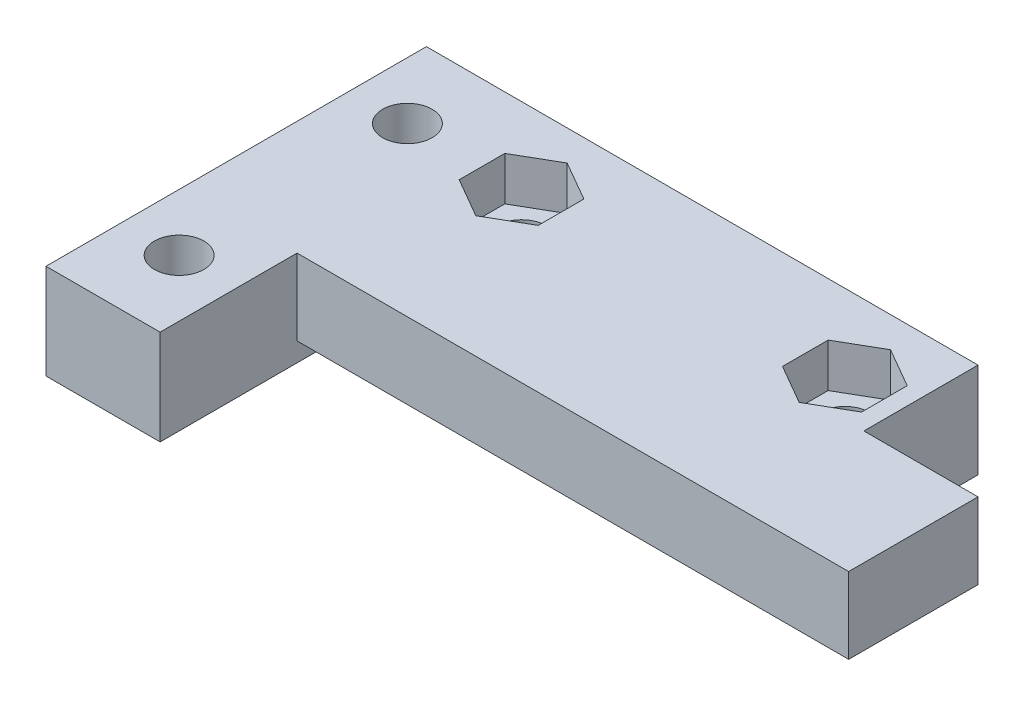
ISO-10303-21;
HEADER;
FILE_DESCRIPTION(('STEP AP214'),'2;1');
FILE_NAME('part.step','',(''),(''),'','','');
FILE_SCHEMA(('AUTOMOTIVE_DESIGN { 1 0 10303 214 1 1 1 1 }'));
ENDSEC;
DATA;
#1=APPLICATION_CONTEXT('core data for automotive mechanical design processes');
#2=APPLICATION_PROTOCOL_DEFINITION('international standard','automotive_design',2000,#1);
#3=PRODUCT_CONTEXT('',#1,'mechanical');
#4=PRODUCT('Part','Part','',(#3));
#5=PRODUCT_RELATED_PRODUCT_CATEGORY('part','',(#4));
#6=PRODUCT_DEFINITION_FORMATION('','',#4);
#7=PRODUCT_DEFINITION_CONTEXT('part definition',#1,'design');
#8=PRODUCT_DEFINITION('design','',#6,#7);
#9=PRODUCT_DEFINITION_SHAPE('','',#8);
#10=(LENGTH_UNIT() NAMED_UNIT(*) SI_UNIT(.MILLI.,.METRE.));
#11=(NAMED_UNIT(*) PLANE_ANGLE_UNIT() SI_UNIT($,.RADIAN.));
#12=(NAMED_UNIT(*) SI_UNIT($,.STERADIAN.) SOLID_ANGLE_UNIT());
#13=UNCERTAINTY_MEASURE_WITH_UNIT(LENGTH_MEASURE(1.E-05),#10,'distance_accuracy_value','');
#14=(GEOMETRIC_REPRESENTATION_CONTEXT(3) GLOBAL_UNCERTAINTY_ASSIGNED_CONTEXT((#13)) GLOBAL_UNIT_ASSIGNED_CONTEXT((#10,
#11,#12)) REPRESENTATION_CONTEXT('',''));
#15=CARTESIAN_POINT('',(0.,0.,0.));
#16=DIRECTION('',(0.,0.,1.));
#17=DIRECTION('',(1.,0.,0.));
#18=AXIS2_PLACEMENT_3D('',#15,#16,#17);
#19=CARTESIAN_POINT('',(3.,5.,-16.));
#20=DIRECTION('',(0.,-1.,0.));
#21=DIRECTION('',(0.,0.,-1.));
#22=AXIS2_PLACEMENT_3D('',#19,#20,#21);
#23=CYLINDRICAL_SURFACE('',#22,1.3);
#24=CARTESIAN_POINT('',(3.,5.,-16.));
#25=DIRECTION('',(0.,1.,0.));
#26=DIRECTION('',(0.,0.,1.));
#27=AXIS2_PLACEMENT_3D('',#24,#25,#26);
#28=CIRCLE('',#27,1.3);
#29=CARTESIAN_POINT('',(3.,5.,-14.7));
#30=VERTEX_POINT('',#29);
#31=EDGE_CURVE('E296',#30,#30,#28,.T.);
#32=ORIENTED_EDGE('',*,*,#31,.T.);
#33=EDGE_LOOP('',(#32));
#34=FACE_BOUND('',#33,.T.);
#35=CARTESIAN_POINT('',(3.,2.,-16.));
#36=DIRECTION('',(0.,-1.,0.));
#37=DIRECTION('',(0.,0.,-1.));
#38=AXIS2_PLACEMENT_3D('',#35,#36,#37);
#39=CIRCLE('',#38,1.3);
#40=CARTESIAN_POINT('',(3.,2.,-17.3));
#41=VERTEX_POINT('',#40);
#42=EDGE_CURVE('E37',#41,#41,#39,.T.);
#43=ORIENTED_EDGE('',*,*,#42,.T.);
#44=EDGE_LOOP('',(#43));
#45=FACE_BOUND('',#44,.T.);
#46=ADVANCED_FACE('F33',(#34,#45),#23,.F.);
#47=CARTESIAN_POINT('',(3.,5.,-4.));
#48=DIRECTION('',(0.,-1.,0.));
#49=DIRECTION('',(0.,0.,-1.));
#50=AXIS2_PLACEMENT_3D('',#47,#48,#49);
#51=CYLINDRICAL_SURFACE('',#50,1.3);
#52=CARTESIAN_POINT('',(3.,5.,-4.));
#53=DIRECTION('',(0.,1.,0.));
#54=DIRECTION('',(0.,0.,1.));
#55=AXIS2_PLACEMENT_3D('',#52,#53,#54);
#56=CIRCLE('',#55,1.3);
#57=CARTESIAN_POINT('',(3.,5.,-2.7));
#58=VERTEX_POINT('',#57);
#59=EDGE_CURVE('E293',#58,#58,#56,.T.);
#60=ORIENTED_EDGE('',*,*,#59,.T.);
#61=EDGE_LOOP('',(#60));
#62=FACE_BOUND('',#61,.T.);
#63=CARTESIAN_POINT('',(3.,2.,-4.));
#64=DIRECTION('',(0.,-1.,0.));
#65=DIRECTION('',(0.,0.,-1.));
#66=AXIS2_PLACEMENT_3D('',#63,#64,#65);
#67=CIRCLE('',#66,1.3);
#68=CARTESIAN_POINT('',(3.,2.,-5.3));
#69=VERTEX_POINT('',#68);
#70=EDGE_CURVE('E220',#69,#69,#67,.T.);
#71=ORIENTED_EDGE('',*,*,#70,.T.);
#72=EDGE_LOOP('',(#71));
#73=FACE_BOUND('',#72,.T.);
#74=ADVANCED_FACE('F404',(#62,#73),#51,.F.);
#75=CARTESIAN_POINT('',(26.,5.,-16.));
#76=DIRECTION('',(0.,-1.,0.));
#77=DIRECTION('',(0.,0.,-1.));
#78=AXIS2_PLACEMENT_3D('',#75,#76,#77);
#79=CYLINDRICAL_SURFACE('',#78,1.3);
#80=CARTESIAN_POINT('',(26.,0.,-16.));
#81=DIRECTION('',(0.,1.,0.));
#82=DIRECTION('',(0.,0.,1.));
#83=AXIS2_PLACEMENT_3D('',#80,#81,#82);
#84=CIRCLE('',#83,1.3);
#85=CARTESIAN_POINT('',(26.,0.,-14.7));
#86=VERTEX_POINT('',#85);
#87=EDGE_CURVE('E287',#86,#86,#84,.T.);
#88=ORIENTED_EDGE('',*,*,#87,.F.);
#89=EDGE_LOOP('',(#88));
#90=FACE_BOUND('',#89,.T.);
#91=CARTESIAN_POINT('',(26.,2.7,-16.));
#92=DIRECTION('',(0.,1.,0.));
#93=DIRECTION('',(0.,0.,1.));
#94=AXIS2_PLACEMENT_3D('',#91,#92,#93);
#95=CIRCLE('',#94,1.3);
#96=CARTESIAN_POINT('',(26.,2.7,-14.7));
#97=VERTEX_POINT('',#96);
#98=EDGE_CURVE('E232',#97,#97,#95,.T.);
#99=ORIENTED_EDGE('',*,*,#98,.T.);
#100=EDGE_LOOP('',(#99));
#101=FACE_BOUND('',#100,.T.);
#102=ADVANCED_FACE('F410',(#90,#101),#79,.F.);
#103=CARTESIAN_POINT('',(9.,5.,-16.));
#104=DIRECTION('',(0.,-1.,0.));
#105=DIRECTION('',(0.,0.,-1.));
#106=AXIS2_PLACEMENT_3D('',#103,#104,#105);
#107=CYLINDRICAL_SURFACE('',#106,1.3);
#108=CARTESIAN_POINT('',(9.,0.,-16.));
#109=DIRECTION('',(0.,1.,0.));
#110=DIRECTION('',(0.,0.,1.));
#111=AXIS2_PLACEMENT_3D('',#108,#109,#110);
#112=CIRCLE('',#111,1.3);
#113=CARTESIAN_POINT('',(9.,0.,-14.7));
#114=VERTEX_POINT('',#113);
#115=EDGE_CURVE('E290',#114,#114,#112,.T.);
#116=ORIENTED_EDGE('',*,*,#115,.F.);
#117=EDGE_LOOP('',(#116));
#118=FACE_BOUND('',#117,.T.);
#119=CARTESIAN_POINT('',(9.,2.7,-16.));
#120=DIRECTION('',(0.,1.,0.));
#121=DIRECTION('',(0.,0.,1.));
#122=AXIS2_PLACEMENT_3D('',#119,#120,#121);
#123=CIRCLE('',#122,1.3);
#124=CARTESIAN_POINT('',(9.,2.7,-14.7));
#125=VERTEX_POINT('',#124);
#126=EDGE_CURVE('E277',#125,#125,#123,.T.);
#127=ORIENTED_EDGE('',*,*,#126,.T.);
#128=EDGE_LOOP('',(#127));
#129=FACE_BOUND('',#128,.T.);
#130=ADVANCED_FACE('F446',(#118,#129),#107,.F.);
#131=CARTESIAN_POINT('',(0.,5.,0.));
#132=DIRECTION('',(0.,-1.,0.));
#133=DIRECTION('',(0.,0.,-1.));
#134=AXIS2_PLACEMENT_3D('',#131,#132,#133);
#135=PLANE('',#134);
#136=DIRECTION('',(-0.866025403784439,0.,0.5));
#137=VECTOR('',#136,1.);
#138=CARTESIAN_POINT('',(-1.46743371481683,5.,-2.5416697508023));
#139=LINE('',#138,#137);
#140=CARTESIAN_POINT('',(26.,5.,-18.4));
#141=VERTEX_POINT('',#140);
#142=CARTESIAN_POINT('',(23.9215390309173,5.,-17.2));
#143=VERTEX_POINT('',#142);
#144=EDGE_CURVE('E219',#141,#143,#139,.T.);
#145=ORIENTED_EDGE('',*,*,#144,.F.);
#146=DIRECTION('',(-0.866025403784439,0.,-0.499999999999999));
#147=VECTOR('',#146,1.);
#148=CARTESIAN_POINT('',(14.4674337148168,5.,-25.0583302491977));
#149=LINE('',#148,#147);
#150=CARTESIAN_POINT('',(28.0784609690827,5.,-17.2));
#151=VERTEX_POINT('',#150);
#152=EDGE_CURVE('E50',#151,#141,#149,.T.);
#153=ORIENTED_EDGE('',*,*,#152,.F.);
#154=DIRECTION('',(0.,0.,-1.));
#155=VECTOR('',#154,1.);
#156=CARTESIAN_POINT('',(28.0784609690827,5.,0.));
#157=LINE('',#156,#155);
#158=CARTESIAN_POINT('',(28.0784609690827,5.,-14.8));
#159=VERTEX_POINT('',#158);
#160=EDGE_CURVE('E202',#159,#151,#157,.T.);
#161=ORIENTED_EDGE('',*,*,#160,.F.);
#162=DIRECTION('',(0.866025403784439,0.,-0.5));
#163=VECTOR('',#162,1.);
#164=CARTESIAN_POINT('',(0.611027254265821,5.,1.05833024919771));
#165=LINE('',#164,#163);
#166=CARTESIAN_POINT('',(26.,5.,-13.6));
#167=VERTEX_POINT('',#166);
#168=EDGE_CURVE('E205',#167,#159,#165,.T.);
#169=ORIENTED_EDGE('',*,*,#168,.F.);
#170=DIRECTION('',(0.866025403784439,0.,0.5));
#171=VECTOR('',#170,1.);
#172=CARTESIAN_POINT('',(12.3889727457342,5.,-21.4583302491977));
#173=LINE('',#172,#171);
#174=CARTESIAN_POINT('',(23.9215390309174,5.,-14.8));
#175=VERTEX_POINT('',#174);
#176=EDGE_CURVE('E225',#175,#167,#173,.T.);
#177=ORIENTED_EDGE('',*,*,#176,.F.);
#178=DIRECTION('',(0.,0.,1.));
#179=VECTOR('',#178,1.);
#180=CARTESIAN_POINT('',(23.9215390309173,5.,0.));
#181=LINE('',#180,#179);
#182=EDGE_CURVE('E222',#143,#175,#181,.T.);
#183=ORIENTED_EDGE('',*,*,#182,.F.);
#184=EDGE_LOOP('',(#145,#153,#161,#169,#177,#183));
#185=FACE_BOUND('',#184,.T.);
#186=DIRECTION('',(-0.866025403784439,0.,0.5));
#187=VECTOR('',#186,1.);
#188=CARTESIAN_POINT('',(-5.71743371481683,5.,-9.90288568297003));
#189=LINE('',#188,#187);
#190=CARTESIAN_POINT('',(9.00000000000001,5.,-18.4));
#191=VERTEX_POINT('',#190);
#192=CARTESIAN_POINT('',(6.92153903091735,5.,-17.2));
#193=VERTEX_POINT('',#192);
#194=EDGE_CURVE('E261',#191,#193,#189,.T.);
#195=ORIENTED_EDGE('',*,*,#194,.F.);
#196=DIRECTION('',(-0.866025403784438,0.,-0.500000000000002));
#197=VECTOR('',#196,1.);
#198=CARTESIAN_POINT('',(10.2174337148169,5.,-17.69711431703));
#199=LINE('',#198,#197);
#200=CARTESIAN_POINT('',(11.0784609690827,5.,-17.2));
#201=VERTEX_POINT('',#200);
#202=EDGE_CURVE('E58',#201,#191,#199,.T.);
#203=ORIENTED_EDGE('',*,*,#202,.F.);
#204=DIRECTION('',(0.,0.,-1.));
#205=VECTOR('',#204,1.);
#206=CARTESIAN_POINT('',(11.0784609690827,5.,0.));
#207=LINE('',#206,#205);
#208=CARTESIAN_POINT('',(11.0784609690827,5.,-14.8));
#209=VERTEX_POINT('',#208);
#210=EDGE_CURVE('E244',#209,#201,#207,.T.);
#211=ORIENTED_EDGE('',*,*,#210,.F.);
#212=DIRECTION('',(0.866025403784439,0.,-0.5));
#213=VECTOR('',#212,1.);
#214=CARTESIAN_POINT('',(-3.63897274573418,5.,-6.30288568297002));
#215=LINE('',#214,#213);
#216=CARTESIAN_POINT('',(9.,5.,-13.6));
#217=VERTEX_POINT('',#216);
#218=EDGE_CURVE('E270',#217,#209,#215,.T.);
#219=ORIENTED_EDGE('',*,*,#218,.F.);
#220=DIRECTION('',(0.866025403784438,0.,0.5));
#221=VECTOR('',#220,1.);
#222=CARTESIAN_POINT('',(8.13897274573419,5.,-14.09711431703));
#223=LINE('',#222,#221);
#224=CARTESIAN_POINT('',(6.92153903091735,5.,-14.8));
#225=VERTEX_POINT('',#224);
#226=EDGE_CURVE('E267',#225,#217,#223,.T.);
#227=ORIENTED_EDGE('',*,*,#226,.F.);
#228=DIRECTION('',(0.,0.,1.));
#229=VECTOR('',#228,1.);
#230=CARTESIAN_POINT('',(6.92153903091735,5.,0.));
#231=LINE('',#230,#229);
#232=EDGE_CURVE('E264',#193,#225,#231,.T.);
#233=ORIENTED_EDGE('',*,*,#232,.F.);
#234=EDGE_LOOP('',(#195,#203,#211,#219,#227,#233));
#235=FACE_BOUND('',#234,.T.);
#236=ORIENTED_EDGE('',*,*,#31,.F.);
#237=EDGE_LOOP('',(#236));
#238=FACE_BOUND('',#237,.T.);
#239=DIRECTION('',(0.,0.,1.));
#240=VECTOR('',#239,1.);
#241=CARTESIAN_POINT('',(29.,5.,-20.));
#242=LINE('',#241,#240);
#243=CARTESIAN_POINT('',(29.,5.,-20.));
#244=VERTEX_POINT('',#243);
#245=CARTESIAN_POINT('',(29.,5.,-14.));
#246=VERTEX_POINT('',#245);
#247=EDGE_CURVE('E300',#244,#246,#242,.T.);
#248=ORIENTED_EDGE('',*,*,#247,.F.);
#249=DIRECTION('',(-1.,0.,0.));
#250=VECTOR('',#249,1.);
#251=CARTESIAN_POINT('',(0.,5.,-20.));
#252=LINE('',#251,#250);
#253=CARTESIAN_POINT('',(0.,5.,-20.));
#254=VERTEX_POINT('',#253);
#255=EDGE_CURVE('E354',#244,#254,#252,.T.);
#256=ORIENTED_EDGE('',*,*,#255,.T.);
#257=DIRECTION('',(0.,0.,1.));
#258=VECTOR('',#257,1.);
#259=CARTESIAN_POINT('',(0.,5.,0.));
#260=LINE('',#259,#258);
#261=CARTESIAN_POINT('',(0.,5.,0.));
#262=VERTEX_POINT('',#261);
#263=EDGE_CURVE('E344',#254,#262,#260,.T.);
#264=ORIENTED_EDGE('',*,*,#263,.T.);
#265=DIRECTION('',(1.,0.,0.));
#266=VECTOR('',#265,1.);
#267=CARTESIAN_POINT('',(0.,5.,0.));
#268=LINE('',#267,#266);
#269=CARTESIAN_POINT('',(6.,5.,0.));
#270=VERTEX_POINT('',#269);
#271=EDGE_CURVE('E347',#262,#270,#268,.T.);
#272=ORIENTED_EDGE('',*,*,#271,.T.);
#273=DIRECTION('',(0.,0.,1.));
#274=VECTOR('',#273,1.);
#275=CARTESIAN_POINT('',(6.,5.,0.));
#276=LINE('',#275,#274);
#277=CARTESIAN_POINT('',(6.,5.,-7.2));
#278=VERTEX_POINT('',#277);
#279=EDGE_CURVE('E313',#278,#270,#276,.T.);
#280=ORIENTED_EDGE('',*,*,#279,.F.);
#281=DIRECTION('',(-1.,0.,0.));
#282=VECTOR('',#281,1.);
#283=CARTESIAN_POINT('',(6.,5.,-7.2));
#284=LINE('',#283,#282);
#285=CARTESIAN_POINT('',(35.,5.,-7.2));
#286=VERTEX_POINT('',#285);
#287=EDGE_CURVE('E316',#286,#278,#284,.T.);
#288=ORIENTED_EDGE('',*,*,#287,.F.);
#289=DIRECTION('',(0.,0.,-1.));
#290=VECTOR('',#289,1.);
#291=CARTESIAN_POINT('',(35.,5.,0.));
#292=LINE('',#291,#290);
#293=CARTESIAN_POINT('',(35.,5.,-14.));
#294=VERTEX_POINT('',#293);
#295=EDGE_CURVE('E351',#286,#294,#292,.T.);
#296=ORIENTED_EDGE('',*,*,#295,.T.);
#297=DIRECTION('',(1.,0.,0.));
#298=VECTOR('',#297,1.);
#299=CARTESIAN_POINT('',(35.,5.,-14.));
#300=LINE('',#299,#298);
#301=EDGE_CURVE('E302',#246,#294,#300,.T.);
#302=ORIENTED_EDGE('',*,*,#301,.F.);
#303=EDGE_LOOP('',(#248,#256,#264,#272,#280,#288,#296,#302));
#304=FACE_BOUND('',#303,.T.);
#305=ORIENTED_EDGE('',*,*,#59,.F.);
#306=EDGE_LOOP('',(#305));
#307=FACE_BOUND('',#306,.T.);
#308=ADVANCED_FACE('F442',(#185,#235,#238,#304,#307),#135,.F.);
#309=CARTESIAN_POINT('',(0.,0.,0.));
#310=DIRECTION('',(0.,-1.,0.));
#311=DIRECTION('',(0.,0.,-1.));
#312=AXIS2_PLACEMENT_3D('',#309,#310,#311);
#313=PLANE('',#312);
#314=CARTESIAN_POINT('',(3.,0.,-16.));
#315=DIRECTION('',(0.,-1.,0.));
#316=DIRECTION('',(0.,0.,-1.));
#317=AXIS2_PLACEMENT_3D('',#314,#315,#316);
#318=CIRCLE('',#317,2.2);
#319=CARTESIAN_POINT('',(3.,0.,-18.2));
#320=VERTEX_POINT('',#319);
#321=EDGE_CURVE('E382',#320,#320,#318,.T.);
#322=ORIENTED_EDGE('',*,*,#321,.F.);
#323=EDGE_LOOP('',(#322));
#324=FACE_BOUND('',#323,.T.);
#325=CARTESIAN_POINT('',(3.,0.,-4.));
#326=DIRECTION('',(0.,-1.,0.));
#327=DIRECTION('',(0.,0.,-1.));
#328=AXIS2_PLACEMENT_3D('',#325,#326,#327);
#329=CIRCLE('',#328,2.2);
#330=CARTESIAN_POINT('',(3.,0.,-6.2));
#331=VERTEX_POINT('',#330);
#332=EDGE_CURVE('E208',#331,#331,#329,.T.);
#333=ORIENTED_EDGE('',*,*,#332,.F.);
#334=EDGE_LOOP('',(#333));
#335=FACE_BOUND('',#334,.T.);
#336=ORIENTED_EDGE('',*,*,#115,.T.);
#337=EDGE_LOOP('',(#336));
#338=FACE_BOUND('',#337,.T.);
#339=DIRECTION('',(-1.,0.,0.));
#340=VECTOR('',#339,1.);
#341=CARTESIAN_POINT('',(0.,0.,-20.));
#342=LINE('',#341,#340);
#343=CARTESIAN_POINT('',(29.,0.,-20.));
#344=VERTEX_POINT('',#343);
#345=CARTESIAN_POINT('',(0.,0.,-20.));
#346=VERTEX_POINT('',#345);
#347=EDGE_CURVE('E348',#344,#346,#342,.T.);
#348=ORIENTED_EDGE('',*,*,#347,.F.);
#349=DIRECTION('',(0.,0.,1.));
#350=VECTOR('',#349,1.);
#351=CARTESIAN_POINT('',(29.,0.,-20.));
#352=LINE('',#351,#350);
#353=CARTESIAN_POINT('',(29.,0.,-14.));
#354=VERTEX_POINT('',#353);
#355=EDGE_CURVE('E299',#344,#354,#352,.T.);
#356=ORIENTED_EDGE('',*,*,#355,.T.);
#357=DIRECTION('',(-1.,0.,0.));
#358=VECTOR('',#357,1.);
#359=CARTESIAN_POINT('',(6.,0.,-14.));
#360=LINE('',#359,#358);
#361=CARTESIAN_POINT('',(6.,0.,-14.));
#362=VERTEX_POINT('',#361);
#363=EDGE_CURVE('E328',#354,#362,#360,.T.);
#364=ORIENTED_EDGE('',*,*,#363,.T.);
#365=DIRECTION('',(0.,0.,1.));
#366=VECTOR('',#365,1.);
#367=CARTESIAN_POINT('',(6.,0.,0.));
#368=LINE('',#367,#366);
#369=CARTESIAN_POINT('',(6.,0.,0.));
#370=VERTEX_POINT('',#369);
#371=EDGE_CURVE('E323',#362,#370,#368,.T.);
#372=ORIENTED_EDGE('',*,*,#371,.T.);
#373=DIRECTION('',(1.,0.,0.));
#374=VECTOR('',#373,1.);
#375=CARTESIAN_POINT('',(0.,0.,0.));
#376=LINE('',#375,#374);
#377=CARTESIAN_POINT('',(0.,0.,0.));
#378=VERTEX_POINT('',#377);
#379=EDGE_CURVE('E359',#378,#370,#376,.T.);
#380=ORIENTED_EDGE('',*,*,#379,.F.);
#381=DIRECTION('',(0.,0.,1.));
#382=VECTOR('',#381,1.);
#383=CARTESIAN_POINT('',(0.,0.,0.));
#384=LINE('',#383,#382);
#385=EDGE_CURVE('E343',#346,#378,#384,.T.);
#386=ORIENTED_EDGE('',*,*,#385,.F.);
#387=EDGE_LOOP('',(#348,#356,#364,#372,#380,#386));
#388=FACE_BOUND('',#387,.T.);
#389=ORIENTED_EDGE('',*,*,#87,.T.);
#390=EDGE_LOOP('',(#389));
#391=FACE_BOUND('',#390,.T.);
#392=ADVANCED_FACE('F445',(#324,#335,#338,#388,#391),#313,.T.);
#393=CARTESIAN_POINT('',(35.,5.,0.));
#394=DIRECTION('',(-1.,0.,0.));
#395=DIRECTION('',(0.,0.,1.));
#396=AXIS2_PLACEMENT_3D('',#393,#394,#395);
#397=PLANE('',#396);
#398=DIRECTION('',(0.,-1.,0.));
#399=VECTOR('',#398,1.);
#400=CARTESIAN_POINT('',(35.,5.,-14.));
#401=LINE('',#400,#399);
#402=CARTESIAN_POINT('',(35.,1.,-14.));
#403=VERTEX_POINT('',#402);
#404=EDGE_CURVE('E304',#294,#403,#401,.T.);
#405=ORIENTED_EDGE('',*,*,#404,.F.);
#406=ORIENTED_EDGE('',*,*,#295,.F.);
#407=DIRECTION('',(0.,-1.,0.));
#408=VECTOR('',#407,1.);
#409=CARTESIAN_POINT('',(35.,5.,-7.2));
#410=LINE('',#409,#408);
#411=CARTESIAN_POINT('',(35.,1.,-7.2));
#412=VERTEX_POINT('',#411);
#413=EDGE_CURVE('E320',#286,#412,#410,.T.);
#414=ORIENTED_EDGE('',*,*,#413,.T.);
#415=DIRECTION('',(0.,0.,-1.));
#416=VECTOR('',#415,1.);
#417=CARTESIAN_POINT('',(35.,1.,0.));
#418=LINE('',#417,#416);
#419=EDGE_CURVE('E327',#412,#403,#418,.T.);
#420=ORIENTED_EDGE('',*,*,#419,.T.);
#421=EDGE_LOOP('',(#405,#406,#414,#420));
#422=FACE_BOUND('',#421,.T.);
#423=ADVANCED_FACE('F450',(#422),#397,.F.);
#424=CARTESIAN_POINT('',(0.,5.,-20.));
#425=DIRECTION('',(0.,0.,1.));
#426=DIRECTION('',(1.,0.,0.));
#427=AXIS2_PLACEMENT_3D('',#424,#425,#426);
#428=PLANE('',#427);
#429=DIRECTION('',(0.,-1.,0.));
#430=VECTOR('',#429,1.);
#431=CARTESIAN_POINT('',(29.,5.,-20.));
#432=LINE('',#431,#430);
#433=EDGE_CURVE('E310',#244,#344,#432,.T.);
#434=ORIENTED_EDGE('',*,*,#433,.T.);
#435=ORIENTED_EDGE('',*,*,#347,.T.);
#436=DIRECTION('',(0.,-1.,0.));
#437=VECTOR('',#436,1.);
#438=CARTESIAN_POINT('',(0.,5.,-20.));
#439=LINE('',#438,#437);
#440=EDGE_CURVE('E356',#254,#346,#439,.T.);
#441=ORIENTED_EDGE('',*,*,#440,.F.);
#442=ORIENTED_EDGE('',*,*,#255,.F.);
#443=EDGE_LOOP('',(#434,#435,#441,#442));
#444=FACE_BOUND('',#443,.T.);
#445=ADVANCED_FACE('F437',(#444),#428,.F.);
#446=CARTESIAN_POINT('',(6.,1.,-14.));
#447=DIRECTION('',(0.,0.,1.));
#448=DIRECTION('',(1.,0.,0.));
#449=AXIS2_PLACEMENT_3D('',#446,#447,#448);
#450=PLANE('',#449);
#451=ORIENTED_EDGE('',*,*,#363,.F.);
#452=DIRECTION('',(0.,1.,0.));
#453=VECTOR('',#452,1.);
#454=CARTESIAN_POINT('',(29.,1.,-14.));
#455=LINE('',#454,#453);
#456=CARTESIAN_POINT('',(29.,1.,-14.));
#457=VERTEX_POINT('',#456);
#458=EDGE_CURVE('E11',#354,#457,#455,.T.);
#459=ORIENTED_EDGE('',*,*,#458,.T.);
#460=DIRECTION('',(-1.,0.,0.));
#461=VECTOR('',#460,1.);
#462=CARTESIAN_POINT('',(6.,1.,-14.));
#463=LINE('',#462,#461);
#464=CARTESIAN_POINT('',(6.,1.,-14.));
#465=VERTEX_POINT('',#464);
#466=EDGE_CURVE('E331',#457,#465,#463,.T.);
#467=ORIENTED_EDGE('',*,*,#466,.T.);
#468=DIRECTION('',(0.,-1.,0.));
#469=VECTOR('',#468,1.);
#470=CARTESIAN_POINT('',(6.,1.,-14.));
#471=LINE('',#470,#469);
#472=EDGE_CURVE('E335',#465,#362,#471,.T.);
#473=ORIENTED_EDGE('',*,*,#472,.T.);
#474=EDGE_LOOP('',(#451,#459,#467,#473));
#475=FACE_BOUND('',#474,.T.);
#476=ADVANCED_FACE('F434',(#475),#450,.T.);
#477=CARTESIAN_POINT('',(0.,5.,0.));
#478=DIRECTION('',(0.,0.,-1.));
#479=DIRECTION('',(-1.,0.,0.));
#480=AXIS2_PLACEMENT_3D('',#477,#478,#479);
#481=PLANE('',#480);
#482=DIRECTION('',(0.,-1.,0.));
#483=VECTOR('',#482,1.);
#484=CARTESIAN_POINT('',(6.,1.,0.));
#485=LINE('',#484,#483);
#486=EDGE_CURVE('E340',#270,#370,#485,.T.);
#487=ORIENTED_EDGE('',*,*,#486,.F.);
#488=ORIENTED_EDGE('',*,*,#271,.F.);
#489=DIRECTION('',(0.,-1.,0.));
#490=VECTOR('',#489,1.);
#491=CARTESIAN_POINT('',(0.,5.,0.));
#492=LINE('',#491,#490);
#493=EDGE_CURVE('E365',#262,#378,#492,.T.);
#494=ORIENTED_EDGE('',*,*,#493,.T.);
#495=ORIENTED_EDGE('',*,*,#379,.T.);
#496=EDGE_LOOP('',(#487,#488,#494,#495));
#497=FACE_BOUND('',#496,.T.);
#498=ADVANCED_FACE('F432',(#497),#481,.F.);
#499=CARTESIAN_POINT('',(0.,1.,0.));
#500=DIRECTION('',(0.,-1.,0.));
#501=DIRECTION('',(0.,0.,-1.));
#502=AXIS2_PLACEMENT_3D('',#499,#500,#501);
#503=PLANE('',#502);
#504=ORIENTED_EDGE('',*,*,#419,.F.);
#505=DIRECTION('',(-1.,0.,0.));
#506=VECTOR('',#505,1.);
#507=CARTESIAN_POINT('',(0.,1.,-7.2));
#508=LINE('',#507,#506);
#509=CARTESIAN_POINT('',(6.,1.,-7.2));
#510=VERTEX_POINT('',#509);
#511=EDGE_CURVE('E42',#412,#510,#508,.T.);
#512=ORIENTED_EDGE('',*,*,#511,.T.);
#513=DIRECTION('',(0.,0.,1.));
#514=VECTOR('',#513,1.);
#515=CARTESIAN_POINT('',(6.,1.,0.));
#516=LINE('',#515,#514);
#517=EDGE_CURVE('E324',#465,#510,#516,.T.);
#518=ORIENTED_EDGE('',*,*,#517,.F.);
#519=ORIENTED_EDGE('',*,*,#466,.F.);
#520=EDGE_CURVE('E332',#403,#457,#463,.T.);
#521=ORIENTED_EDGE('',*,*,#520,.F.);
#522=EDGE_LOOP('',(#504,#512,#518,#519,#521));
#523=FACE_BOUND('',#522,.T.);
#524=ADVANCED_FACE('F429',(#523),#503,.T.);
#525=CARTESIAN_POINT('',(0.,5.,0.));
#526=DIRECTION('',(1.,0.,0.));
#527=DIRECTION('',(0.,0.,-1.));
#528=AXIS2_PLACEMENT_3D('',#525,#526,#527);
#529=PLANE('',#528);
#530=ORIENTED_EDGE('',*,*,#385,.T.);
#531=ORIENTED_EDGE('',*,*,#493,.F.);
#532=ORIENTED_EDGE('',*,*,#263,.F.);
#533=ORIENTED_EDGE('',*,*,#440,.T.);
#534=EDGE_LOOP('',(#530,#531,#532,#533));
#535=FACE_BOUND('',#534,.T.);
#536=ADVANCED_FACE('F35',(#535),#529,.F.);
#537=CARTESIAN_POINT('',(6.,1.,0.));
#538=DIRECTION('',(1.,0.,0.));
#539=DIRECTION('',(0.,0.,-1.));
#540=AXIS2_PLACEMENT_3D('',#537,#538,#539);
#541=PLANE('',#540);
#542=ORIENTED_EDGE('',*,*,#486,.T.);
#543=ORIENTED_EDGE('',*,*,#371,.F.);
#544=ORIENTED_EDGE('',*,*,#472,.F.);
#545=ORIENTED_EDGE('',*,*,#517,.T.);
#546=DIRECTION('',(0.,-1.,0.));
#547=VECTOR('',#546,1.);
#548=CARTESIAN_POINT('',(6.,5.,-7.2));
#549=LINE('',#548,#547);
#550=EDGE_CURVE('E318',#278,#510,#549,.T.);
#551=ORIENTED_EDGE('',*,*,#550,.F.);
#552=ORIENTED_EDGE('',*,*,#279,.T.);
#553=EDGE_LOOP('',(#542,#543,#544,#545,#551,#552));
#554=FACE_BOUND('',#553,.T.);
#555=ADVANCED_FACE('F427',(#554),#541,.T.);
#556=CARTESIAN_POINT('',(6.,5.,-7.2));
#557=DIRECTION('',(0.,0.,1.));
#558=DIRECTION('',(1.,0.,0.));
#559=AXIS2_PLACEMENT_3D('',#556,#557,#558);
#560=PLANE('',#559);
#561=ORIENTED_EDGE('',*,*,#413,.F.);
#562=ORIENTED_EDGE('',*,*,#287,.T.);
#563=ORIENTED_EDGE('',*,*,#550,.T.);
#564=ORIENTED_EDGE('',*,*,#511,.F.);
#565=EDGE_LOOP('',(#561,#562,#563,#564));
#566=FACE_BOUND('',#565,.T.);
#567=ADVANCED_FACE('F423',(#566),#560,.T.);
#568=CARTESIAN_POINT('',(29.,5.,-20.));
#569=DIRECTION('',(1.,0.,0.));
#570=DIRECTION('',(0.,0.,-1.));
#571=AXIS2_PLACEMENT_3D('',#568,#569,#570);
#572=PLANE('',#571);
#573=ORIENTED_EDGE('',*,*,#355,.F.);
#574=ORIENTED_EDGE('',*,*,#433,.F.);
#575=ORIENTED_EDGE('',*,*,#247,.T.);
#576=DIRECTION('',(0.,-1.,0.));
#577=VECTOR('',#576,1.);
#578=CARTESIAN_POINT('',(29.,5.,-14.));
#579=LINE('',#578,#577);
#580=EDGE_CURVE('E308',#246,#457,#579,.T.);
#581=ORIENTED_EDGE('',*,*,#580,.T.);
#582=ORIENTED_EDGE('',*,*,#458,.F.);
#583=EDGE_LOOP('',(#573,#574,#575,#581,#582));
#584=FACE_BOUND('',#583,.T.);
#585=ADVANCED_FACE('F419',(#584),#572,.T.);
#586=CARTESIAN_POINT('',(35.,5.,-14.));
#587=DIRECTION('',(0.,0.,-1.));
#588=DIRECTION('',(-1.,0.,0.));
#589=AXIS2_PLACEMENT_3D('',#586,#587,#588);
#590=PLANE('',#589);
#591=ORIENTED_EDGE('',*,*,#580,.F.);
#592=ORIENTED_EDGE('',*,*,#301,.T.);
#593=ORIENTED_EDGE('',*,*,#404,.T.);
#594=ORIENTED_EDGE('',*,*,#520,.T.);
#595=EDGE_LOOP('',(#591,#592,#593,#594));
#596=FACE_BOUND('',#595,.T.);
#597=ADVANCED_FACE('F415',(#596),#590,.T.);
#598=CARTESIAN_POINT('',(10.2174337148169,2.7,-17.69711431703));
#599=DIRECTION('',(0.500000000000002,0.,-0.866025403784438));
#600=DIRECTION('',(-0.866025403784438,0.,-0.500000000000002));
#601=AXIS2_PLACEMENT_3D('',#598,#599,#600);
#602=PLANE('',#601);
#603=ORIENTED_EDGE('',*,*,#202,.T.);
#604=DIRECTION('',(0.,1.,0.));
#605=VECTOR('',#604,1.);
#606=CARTESIAN_POINT('',(9.00000000000001,2.7,-18.4));
#607=LINE('',#606,#605);
#608=CARTESIAN_POINT('',(9.00000000000001,2.7,-18.4));
#609=VERTEX_POINT('',#608);
#610=EDGE_CURVE('E259',#609,#191,#607,.T.);
#611=ORIENTED_EDGE('',*,*,#610,.F.);
#612=DIRECTION('',(-0.866025403784438,0.,-0.500000000000002));
#613=VECTOR('',#612,1.);
#614=CARTESIAN_POINT('',(10.2174337148169,2.7,-17.69711431703));
#615=LINE('',#614,#613);
#616=CARTESIAN_POINT('',(11.0784609690827,2.7,-17.2));
#617=VERTEX_POINT('',#616);
#618=EDGE_CURVE('E240',#617,#609,#615,.T.);
#619=ORIENTED_EDGE('',*,*,#618,.F.);
#620=DIRECTION('',(0.,1.,0.));
#621=VECTOR('',#620,1.);
#622=CARTESIAN_POINT('',(11.0784609690827,2.7,-17.2));
#623=LINE('',#622,#621);
#624=EDGE_CURVE('E275',#617,#201,#623,.T.);
#625=ORIENTED_EDGE('',*,*,#624,.T.);
#626=EDGE_LOOP('',(#603,#611,#619,#625));
#627=FACE_BOUND('',#626,.T.);
#628=ADVANCED_FACE('F418',(#627),#602,.F.);
#629=CARTESIAN_POINT('',(11.0784609690827,2.7,0.));
#630=DIRECTION('',(1.,0.,0.));
#631=DIRECTION('',(0.,0.,-1.));
#632=AXIS2_PLACEMENT_3D('',#629,#630,#631);
#633=PLANE('',#632);
#634=ORIENTED_EDGE('',*,*,#210,.T.);
#635=ORIENTED_EDGE('',*,*,#624,.F.);
#636=DIRECTION('',(0.,0.,-1.));
#637=VECTOR('',#636,1.);
#638=CARTESIAN_POINT('',(11.0784609690827,2.7,0.));
#639=LINE('',#638,#637);
#640=CARTESIAN_POINT('',(11.0784609690827,2.7,-14.8));
#641=VERTEX_POINT('',#640);
#642=EDGE_CURVE('E256',#641,#617,#639,.T.);
#643=ORIENTED_EDGE('',*,*,#642,.F.);
#644=DIRECTION('',(0.,1.,0.));
#645=VECTOR('',#644,1.);
#646=CARTESIAN_POINT('',(11.0784609690827,2.7,-14.8));
#647=LINE('',#646,#645);
#648=EDGE_CURVE('E278',#641,#209,#647,.T.);
#649=ORIENTED_EDGE('',*,*,#648,.T.);
#650=EDGE_LOOP('',(#634,#635,#643,#649));
#651=FACE_BOUND('',#650,.T.);
#652=ADVANCED_FACE('F529',(#651),#633,.F.);
#653=CARTESIAN_POINT('',(-3.63897274573418,2.7,-6.30288568297002));
#654=DIRECTION('',(0.5,0.,0.866025403784439));
#655=DIRECTION('',(0.866025403784439,0.,-0.5));
#656=AXIS2_PLACEMENT_3D('',#653,#654,#655);
#657=PLANE('',#656);
#658=ORIENTED_EDGE('',*,*,#218,.T.);
#659=ORIENTED_EDGE('',*,*,#648,.F.);
#660=DIRECTION('',(0.866025403784439,0.,-0.5));
#661=VECTOR('',#660,1.);
#662=CARTESIAN_POINT('',(-3.63897274573418,2.7,-6.30288568297002));
#663=LINE('',#662,#661);
#664=CARTESIAN_POINT('',(9.,2.7,-13.6));
#665=VERTEX_POINT('',#664);
#666=EDGE_CURVE('E253',#665,#641,#663,.T.);
#667=ORIENTED_EDGE('',*,*,#666,.F.);
#668=DIRECTION('',(0.,1.,0.));
#669=VECTOR('',#668,1.);
#670=CARTESIAN_POINT('',(9.,2.7,-13.6));
#671=LINE('',#670,#669);
#672=EDGE_CURVE('E280',#665,#217,#671,.T.);
#673=ORIENTED_EDGE('',*,*,#672,.T.);
#674=EDGE_LOOP('',(#658,#659,#667,#673));
#675=FACE_BOUND('',#674,.T.);
#676=ADVANCED_FACE('F532',(#675),#657,.F.);
#677=CARTESIAN_POINT('',(8.13897274573419,2.7,-14.09711431703));
#678=DIRECTION('',(-0.5,0.,0.866025403784438));
#679=DIRECTION('',(0.866025403784438,0.,0.5));
#680=AXIS2_PLACEMENT_3D('',#677,#678,#679);
#681=PLANE('',#680);
#682=ORIENTED_EDGE('',*,*,#226,.T.);
#683=ORIENTED_EDGE('',*,*,#672,.F.);
#684=DIRECTION('',(0.866025403784438,0.,0.5));
#685=VECTOR('',#684,1.);
#686=CARTESIAN_POINT('',(8.13897274573419,2.7,-14.09711431703));
#687=LINE('',#686,#685);
#688=CARTESIAN_POINT('',(6.92153903091735,2.7,-14.8));
#689=VERTEX_POINT('',#688);
#690=EDGE_CURVE('E250',#689,#665,#687,.T.);
#691=ORIENTED_EDGE('',*,*,#690,.F.);
#692=DIRECTION('',(0.,1.,0.));
#693=VECTOR('',#692,1.);
#694=CARTESIAN_POINT('',(6.92153903091735,2.7,-14.8));
#695=LINE('',#694,#693);
#696=EDGE_CURVE('E282',#689,#225,#695,.T.);
#697=ORIENTED_EDGE('',*,*,#696,.T.);
#698=EDGE_LOOP('',(#682,#683,#691,#697));
#699=FACE_BOUND('',#698,.T.);
#700=ADVANCED_FACE('F536',(#699),#681,.F.);
#701=CARTESIAN_POINT('',(6.92153903091735,2.7,0.));
#702=DIRECTION('',(-1.,0.,0.));
#703=DIRECTION('',(0.,0.,1.));
#704=AXIS2_PLACEMENT_3D('',#701,#702,#703);
#705=PLANE('',#704);
#706=ORIENTED_EDGE('',*,*,#232,.T.);
#707=ORIENTED_EDGE('',*,*,#696,.F.);
#708=DIRECTION('',(0.,0.,1.));
#709=VECTOR('',#708,1.);
#710=CARTESIAN_POINT('',(6.92153903091735,2.7,0.));
#711=LINE('',#710,#709);
#712=CARTESIAN_POINT('',(6.92153903091735,2.7,-17.2));
#713=VERTEX_POINT('',#712);
#714=EDGE_CURVE('E247',#713,#689,#711,.T.);
#715=ORIENTED_EDGE('',*,*,#714,.F.);
#716=DIRECTION('',(0.,1.,0.));
#717=VECTOR('',#716,1.);
#718=CARTESIAN_POINT('',(6.92153903091735,2.7,-17.2));
#719=LINE('',#718,#717);
#720=EDGE_CURVE('E284',#713,#193,#719,.T.);
#721=ORIENTED_EDGE('',*,*,#720,.T.);
#722=EDGE_LOOP('',(#706,#707,#715,#721));
#723=FACE_BOUND('',#722,.T.);
#724=ADVANCED_FACE('F540',(#723),#705,.F.);
#725=CARTESIAN_POINT('',(-5.71743371481683,2.7,-9.90288568297003));
#726=DIRECTION('',(-0.5,0.,-0.866025403784439));
#727=DIRECTION('',(-0.866025403784439,0.,0.5));
#728=AXIS2_PLACEMENT_3D('',#725,#726,#727);
#729=PLANE('',#728);
#730=ORIENTED_EDGE('',*,*,#194,.T.);
#731=ORIENTED_EDGE('',*,*,#720,.F.);
#732=DIRECTION('',(-0.866025403784439,0.,0.5));
#733=VECTOR('',#732,1.);
#734=CARTESIAN_POINT('',(-5.71743371481683,2.7,-9.90288568297003));
#735=LINE('',#734,#733);
#736=EDGE_CURVE('E243',#609,#713,#735,.T.);
#737=ORIENTED_EDGE('',*,*,#736,.F.);
#738=ORIENTED_EDGE('',*,*,#610,.T.);
#739=EDGE_LOOP('',(#730,#731,#737,#738));
#740=FACE_BOUND('',#739,.T.);
#741=ADVANCED_FACE('F527',(#740),#729,.F.);
#742=CARTESIAN_POINT('',(0.,2.7,0.));
#743=DIRECTION('',(0.,1.,0.));
#744=DIRECTION('',(0.,0.,1.));
#745=AXIS2_PLACEMENT_3D('',#742,#743,#744);
#746=PLANE('',#745);
#747=ORIENTED_EDGE('',*,*,#126,.F.);
#748=EDGE_LOOP('',(#747));
#749=FACE_BOUND('',#748,.T.);
#750=ORIENTED_EDGE('',*,*,#618,.T.);
#751=ORIENTED_EDGE('',*,*,#736,.T.);
#752=ORIENTED_EDGE('',*,*,#714,.T.);
#753=ORIENTED_EDGE('',*,*,#690,.T.);
#754=ORIENTED_EDGE('',*,*,#666,.T.);
#755=ORIENTED_EDGE('',*,*,#642,.T.);
#756=EDGE_LOOP('',(#750,#751,#752,#753,#754,#755));
#757=FACE_BOUND('',#756,.T.);
#758=ADVANCED_FACE('F524',(#749,#757),#746,.T.);
#759=CARTESIAN_POINT('',(14.4674337148168,2.7,-25.0583302491977));
#760=DIRECTION('',(0.499999999999999,0.,-0.866025403784439));
#761=DIRECTION('',(-0.866025403784439,0.,-0.499999999999999));
#762=AXIS2_PLACEMENT_3D('',#759,#760,#761);
#763=PLANE('',#762);
#764=ORIENTED_EDGE('',*,*,#152,.T.);
#765=DIRECTION('',(0.,1.,0.));
#766=VECTOR('',#765,1.);
#767=CARTESIAN_POINT('',(26.,2.7,-18.4));
#768=LINE('',#767,#766);
#769=CARTESIAN_POINT('',(26.,2.7,-18.4));
#770=VERTEX_POINT('',#769);
#771=EDGE_CURVE('E179',#770,#141,#768,.T.);
#772=ORIENTED_EDGE('',*,*,#771,.F.);
#773=DIRECTION('',(-0.866025403784439,0.,-0.499999999999999));
#774=VECTOR('',#773,1.);
#775=CARTESIAN_POINT('',(14.4674337148168,2.7,-25.0583302491977));
#776=LINE('',#775,#774);
#777=CARTESIAN_POINT('',(28.0784609690827,2.7,-17.2));
#778=VERTEX_POINT('',#777);
#779=EDGE_CURVE('E183',#778,#770,#776,.T.);
#780=ORIENTED_EDGE('',*,*,#779,.F.);
#781=DIRECTION('',(0.,1.,0.));
#782=VECTOR('',#781,1.);
#783=CARTESIAN_POINT('',(28.0784609690827,2.7,-17.2));
#784=LINE('',#783,#782);
#785=EDGE_CURVE('E230',#778,#151,#784,.T.);
#786=ORIENTED_EDGE('',*,*,#785,.T.);
#787=EDGE_LOOP('',(#764,#772,#780,#786));
#788=FACE_BOUND('',#787,.T.);
#789=ADVANCED_FACE('F181',(#788),#763,.F.);
#790=CARTESIAN_POINT('',(28.0784609690827,2.7,0.));
#791=DIRECTION('',(1.,0.,0.));
#792=DIRECTION('',(0.,0.,-1.));
#793=AXIS2_PLACEMENT_3D('',#790,#791,#792);
#794=PLANE('',#793);
#795=ORIENTED_EDGE('',*,*,#160,.T.);
#796=ORIENTED_EDGE('',*,*,#785,.F.);
#797=DIRECTION('',(0.,0.,-1.));
#798=VECTOR('',#797,1.);
#799=CARTESIAN_POINT('',(28.0784609690827,2.7,0.));
#800=LINE('',#799,#798);
#801=CARTESIAN_POINT('',(28.0784609690827,2.7,-14.8));
#802=VERTEX_POINT('',#801);
#803=EDGE_CURVE('E189',#802,#778,#800,.T.);
#804=ORIENTED_EDGE('',*,*,#803,.F.);
#805=DIRECTION('',(0.,1.,0.));
#806=VECTOR('',#805,1.);
#807=CARTESIAN_POINT('',(28.0784609690827,2.7,-14.8));
#808=LINE('',#807,#806);
#809=EDGE_CURVE('E233',#802,#159,#808,.T.);
#810=ORIENTED_EDGE('',*,*,#809,.T.);
#811=EDGE_LOOP('',(#795,#796,#804,#810));
#812=FACE_BOUND('',#811,.T.);
#813=ADVANCED_FACE('F507',(#812),#794,.F.);
#814=CARTESIAN_POINT('',(0.611027254265821,2.7,1.05833024919771));
#815=DIRECTION('',(0.5,0.,0.866025403784439));
#816=DIRECTION('',(0.866025403784439,0.,-0.5));
#817=AXIS2_PLACEMENT_3D('',#814,#815,#816);
#818=PLANE('',#817);
#819=ORIENTED_EDGE('',*,*,#168,.T.);
#820=ORIENTED_EDGE('',*,*,#809,.F.);
#821=DIRECTION('',(0.866025403784439,0.,-0.5));
#822=VECTOR('',#821,1.);
#823=CARTESIAN_POINT('',(0.611027254265821,2.7,1.05833024919771));
#824=LINE('',#823,#822);
#825=CARTESIAN_POINT('',(26.,2.7,-13.6));
#826=VERTEX_POINT('',#825);
#827=EDGE_CURVE('E215',#826,#802,#824,.T.);
#828=ORIENTED_EDGE('',*,*,#827,.F.);
#829=DIRECTION('',(0.,1.,0.));
#830=VECTOR('',#829,1.);
#831=CARTESIAN_POINT('',(26.,2.7,-13.6));
#832=LINE('',#831,#830);
#833=EDGE_CURVE('E235',#826,#167,#832,.T.);
#834=ORIENTED_EDGE('',*,*,#833,.T.);
#835=EDGE_LOOP('',(#819,#820,#828,#834));
#836=FACE_BOUND('',#835,.T.);
#837=ADVANCED_FACE('F510',(#836),#818,.F.);
#838=CARTESIAN_POINT('',(12.3889727457342,2.7,-21.4583302491977));
#839=DIRECTION('',(-0.499999999999999,0.,0.866025403784439));
#840=DIRECTION('',(0.866025403784439,0.,0.499999999999999));
#841=AXIS2_PLACEMENT_3D('',#838,#839,#840);
#842=PLANE('',#841);
#843=ORIENTED_EDGE('',*,*,#176,.T.);
#844=ORIENTED_EDGE('',*,*,#833,.F.);
#845=DIRECTION('',(0.866025403784439,0.,0.5));
#846=VECTOR('',#845,1.);
#847=CARTESIAN_POINT('',(12.3889727457342,2.7,-21.4583302491977));
#848=LINE('',#847,#846);
#849=CARTESIAN_POINT('',(23.9215390309174,2.7,-14.8));
#850=VERTEX_POINT('',#849);
#851=EDGE_CURVE('E212',#850,#826,#848,.T.);
#852=ORIENTED_EDGE('',*,*,#851,.F.);
#853=DIRECTION('',(0.,1.,0.));
#854=VECTOR('',#853,1.);
#855=CARTESIAN_POINT('',(23.9215390309174,2.7,-14.8));
#856=LINE('',#855,#854);
#857=EDGE_CURVE('E237',#850,#175,#856,.T.);
#858=ORIENTED_EDGE('',*,*,#857,.T.);
#859=EDGE_LOOP('',(#843,#844,#852,#858));
#860=FACE_BOUND('',#859,.T.);
#861=ADVANCED_FACE('F514',(#860),#842,.F.);
#862=CARTESIAN_POINT('',(23.9215390309173,2.7,0.));
#863=DIRECTION('',(-1.,0.,0.));
#864=DIRECTION('',(0.,0.,1.));
#865=AXIS2_PLACEMENT_3D('',#862,#863,#864);
#866=PLANE('',#865);
#867=ORIENTED_EDGE('',*,*,#182,.T.);
#868=ORIENTED_EDGE('',*,*,#857,.F.);
#869=DIRECTION('',(0.,0.,1.));
#870=VECTOR('',#869,1.);
#871=CARTESIAN_POINT('',(23.9215390309173,2.7,0.));
#872=LINE('',#871,#870);
#873=CARTESIAN_POINT('',(23.9215390309173,2.7,-17.2));
#874=VERTEX_POINT('',#873);
#875=EDGE_CURVE('E197',#874,#850,#872,.T.);
#876=ORIENTED_EDGE('',*,*,#875,.F.);
#877=DIRECTION('',(0.,1.,0.));
#878=VECTOR('',#877,1.);
#879=CARTESIAN_POINT('',(23.9215390309173,2.7,-17.2));
#880=LINE('',#879,#878);
#881=EDGE_CURVE('E188',#874,#143,#880,.T.);
#882=ORIENTED_EDGE('',*,*,#881,.T.);
#883=EDGE_LOOP('',(#867,#868,#876,#882));
#884=FACE_BOUND('',#883,.T.);
#885=ADVANCED_FACE('F503',(#884),#866,.F.);
#886=CARTESIAN_POINT('',(-1.46743371481683,2.7,-2.5416697508023));
#887=DIRECTION('',(-0.5,0.,-0.866025403784439));
#888=DIRECTION('',(-0.866025403784439,0.,0.5));
#889=AXIS2_PLACEMENT_3D('',#886,#887,#888);
#890=PLANE('',#889);
#891=ORIENTED_EDGE('',*,*,#144,.T.);
#892=ORIENTED_EDGE('',*,*,#881,.F.);
#893=DIRECTION('',(-0.866025403784439,0.,0.5));
#894=VECTOR('',#893,1.);
#895=CARTESIAN_POINT('',(-1.46743371481683,2.7,-2.5416697508023));
#896=LINE('',#895,#894);
#897=EDGE_CURVE('E192',#770,#874,#896,.T.);
#898=ORIENTED_EDGE('',*,*,#897,.F.);
#899=ORIENTED_EDGE('',*,*,#771,.T.);
#900=EDGE_LOOP('',(#891,#892,#898,#899));
#901=FACE_BOUND('',#900,.T.);
#902=ADVANCED_FACE('F193',(#901),#890,.F.);
#903=CARTESIAN_POINT('',(0.,2.7,0.));
#904=DIRECTION('',(0.,1.,0.));
#905=DIRECTION('',(0.,0.,1.));
#906=AXIS2_PLACEMENT_3D('',#903,#904,#905);
#907=PLANE('',#906);
#908=ORIENTED_EDGE('',*,*,#98,.F.);
#909=EDGE_LOOP('',(#908));
#910=FACE_BOUND('',#909,.T.);
#911=ORIENTED_EDGE('',*,*,#779,.T.);
#912=ORIENTED_EDGE('',*,*,#897,.T.);
#913=ORIENTED_EDGE('',*,*,#875,.T.);
#914=ORIENTED_EDGE('',*,*,#851,.T.);
#915=ORIENTED_EDGE('',*,*,#827,.T.);
#916=ORIENTED_EDGE('',*,*,#803,.T.);
#917=EDGE_LOOP('',(#911,#912,#913,#914,#915,#916));
#918=FACE_BOUND('',#917,.T.);
#919=ADVANCED_FACE('F199',(#910,#918),#907,.T.);
#920=CARTESIAN_POINT('',(3.,2.,-4.));
#921=DIRECTION('',(0.,-1.,0.));
#922=DIRECTION('',(0.,0.,-1.));
#923=AXIS2_PLACEMENT_3D('',#920,#921,#922);
#924=CYLINDRICAL_SURFACE('',#923,2.2);
#925=CARTESIAN_POINT('',(3.,2.,-4.));
#926=DIRECTION('',(0.,-1.,0.));
#927=DIRECTION('',(0.,0.,-1.));
#928=AXIS2_PLACEMENT_3D('',#925,#926,#927);
#929=CIRCLE('',#928,2.2);
#930=CARTESIAN_POINT('',(3.,2.,-6.2));
#931=VERTEX_POINT('',#930);
#932=EDGE_CURVE('E374',#931,#931,#929,.T.);
#933=ORIENTED_EDGE('',*,*,#932,.F.);
#934=EDGE_LOOP('',(#933));
#935=FACE_BOUND('',#934,.T.);
#936=ORIENTED_EDGE('',*,*,#332,.T.);
#937=EDGE_LOOP('',(#936));
#938=FACE_BOUND('',#937,.T.);
#939=ADVANCED_FACE('F495',(#935,#938),#924,.F.);
#940=CARTESIAN_POINT('',(3.,2.,-4.));
#941=DIRECTION('',(0.,-1.,0.));
#942=DIRECTION('',(0.,0.,-1.));
#943=AXIS2_PLACEMENT_3D('',#940,#941,#942);
#944=PLANE('',#943);
#945=ORIENTED_EDGE('',*,*,#70,.F.);
#946=EDGE_LOOP('',(#945));
#947=FACE_BOUND('',#946,.T.);
#948=ORIENTED_EDGE('',*,*,#932,.T.);
#949=EDGE_LOOP('',(#948));
#950=FACE_BOUND('',#949,.T.);
#951=ADVANCED_FACE('F400',(#947,#950),#944,.T.);
#952=CARTESIAN_POINT('',(3.,2.,-16.));
#953=DIRECTION('',(0.,-1.,0.));
#954=DIRECTION('',(0.,0.,-1.));
#955=AXIS2_PLACEMENT_3D('',#952,#953,#954);
#956=CYLINDRICAL_SURFACE('',#955,2.2);
#957=CARTESIAN_POINT('',(3.,2.,-16.));
#958=DIRECTION('',(0.,-1.,0.));
#959=DIRECTION('',(0.,0.,-1.));
#960=AXIS2_PLACEMENT_3D('',#957,#958,#959);
#961=CIRCLE('',#960,2.2);
#962=CARTESIAN_POINT('',(3.,2.,-18.2));
#963=VERTEX_POINT('',#962);
#964=EDGE_CURVE('E385',#963,#963,#961,.T.);
#965=ORIENTED_EDGE('',*,*,#964,.F.);
#966=EDGE_LOOP('',(#965));
#967=FACE_BOUND('',#966,.T.);
#968=ORIENTED_EDGE('',*,*,#321,.T.);
#969=EDGE_LOOP('',(#968));
#970=FACE_BOUND('',#969,.T.);
#971=ADVANCED_FACE('F395',(#967,#970),#956,.F.);
#972=CARTESIAN_POINT('',(3.,2.,-16.));
#973=DIRECTION('',(0.,-1.,0.));
#974=DIRECTION('',(0.,0.,-1.));
#975=AXIS2_PLACEMENT_3D('',#972,#973,#974);
#976=PLANE('',#975);
#977=ORIENTED_EDGE('',*,*,#42,.F.);
#978=EDGE_LOOP('',(#977));
#979=FACE_BOUND('',#978,.T.);
#980=ORIENTED_EDGE('',*,*,#964,.T.);
#981=EDGE_LOOP('',(#980));
#982=FACE_BOUND('',#981,.T.);
#983=ADVANCED_FACE('F393',(#979,#982),#976,.T.);
#984=CLOSED_SHELL('',(#46,#74,#102,#130,#308,#392,#423,#445,#476,#498,#524,#536,#555,#567,#585,
#597,#628,#652,#676,#700,#724,#741,#758,#789,#813,#837,#861,#885,#902,#919,#939,#951,#971,#983));
#985=MANIFOLD_SOLID_BREP('B2',#984);
#986=ADVANCED_BREP_SHAPE_REPRESENTATION('',(#18,#985),#14);
#987=SHAPE_DEFINITION_REPRESENTATION(#9,#986);
ENDSEC;
END-ISO-10303-21;
